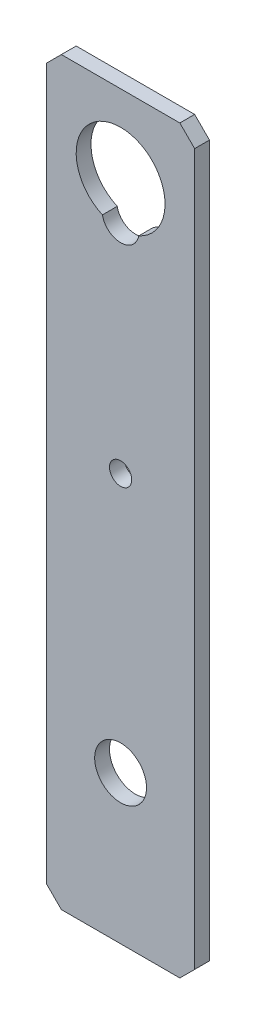
ISO-10303-21;
HEADER;
FILE_DESCRIPTION(('STEP AP214'),'2;1');
FILE_NAME('part.step','',(''),(''),'','','');
FILE_SCHEMA(('AUTOMOTIVE_DESIGN { 1 0 10303 214 1 1 1 1 }'));
ENDSEC;
DATA;
#1=APPLICATION_CONTEXT('core data for automotive mechanical design processes');
#2=APPLICATION_PROTOCOL_DEFINITION('international standard','automotive_design',2000,#1);
#3=PRODUCT_CONTEXT('',#1,'mechanical');
#4=PRODUCT('Part','Part','',(#3));
#5=PRODUCT_RELATED_PRODUCT_CATEGORY('part','',(#4));
#6=PRODUCT_DEFINITION_FORMATION('','',#4);
#7=PRODUCT_DEFINITION_CONTEXT('part definition',#1,'design');
#8=PRODUCT_DEFINITION('design','',#6,#7);
#9=PRODUCT_DEFINITION_SHAPE('','',#8);
#10=(LENGTH_UNIT() NAMED_UNIT(*) SI_UNIT(.MILLI.,.METRE.));
#11=(NAMED_UNIT(*) PLANE_ANGLE_UNIT() SI_UNIT($,.RADIAN.));
#12=(NAMED_UNIT(*) SI_UNIT($,.STERADIAN.) SOLID_ANGLE_UNIT());
#13=UNCERTAINTY_MEASURE_WITH_UNIT(LENGTH_MEASURE(1.E-05),#10,'distance_accuracy_value','');
#14=(GEOMETRIC_REPRESENTATION_CONTEXT(3) GLOBAL_UNCERTAINTY_ASSIGNED_CONTEXT((#13)) GLOBAL_UNIT_ASSIGNED_CONTEXT((#10,
#11,#12)) REPRESENTATION_CONTEXT('',''));
#15=CARTESIAN_POINT('',(0.,0.,0.));
#16=DIRECTION('',(0.,0.,1.));
#17=DIRECTION('',(1.,0.,0.));
#18=AXIS2_PLACEMENT_3D('',#15,#16,#17);
#19=CARTESIAN_POINT('',(9.99999999999999,50.,2.));
#20=DIRECTION('',(-1.,0.,0.));
#21=DIRECTION('',(0.,-1.,0.));
#22=AXIS2_PLACEMENT_3D('',#19,#20,#21);
#23=PLANE('',#22);
#24=DIRECTION('',(0.,1.,0.));
#25=VECTOR('',#24,1.);
#26=CARTESIAN_POINT('',(9.99999999999999,50.,0.));
#27=LINE('',#26,#25);
#28=CARTESIAN_POINT('',(10.,-48.,0.));
#29=VERTEX_POINT('',#28);
#30=CARTESIAN_POINT('',(9.99999999999999,48.,0.));
#31=VERTEX_POINT('',#30);
#32=EDGE_CURVE('E153',#29,#31,#27,.T.);
#33=ORIENTED_EDGE('',*,*,#32,.T.);
#34=DIRECTION('',(0.,0.,1.));
#35=VECTOR('',#34,1.);
#36=CARTESIAN_POINT('',(9.99999999999999,48.,2.));
#37=LINE('',#36,#35);
#38=CARTESIAN_POINT('',(9.99999999999999,48.,2.));
#39=VERTEX_POINT('',#38);
#40=EDGE_CURVE('E190',#31,#39,#37,.T.);
#41=ORIENTED_EDGE('',*,*,#40,.T.);
#42=DIRECTION('',(0.,1.,0.));
#43=VECTOR('',#42,1.);
#44=CARTESIAN_POINT('',(9.99999999999999,50.,2.));
#45=LINE('',#44,#43);
#46=CARTESIAN_POINT('',(10.,-48.,2.));
#47=VERTEX_POINT('',#46);
#48=EDGE_CURVE('E154',#47,#39,#45,.T.);
#49=ORIENTED_EDGE('',*,*,#48,.F.);
#50=DIRECTION('',(0.,0.,-1.));
#51=VECTOR('',#50,1.);
#52=CARTESIAN_POINT('',(10.,-48.,2.));
#53=LINE('',#52,#51);
#54=EDGE_CURVE('E187',#47,#29,#53,.T.);
#55=ORIENTED_EDGE('',*,*,#54,.T.);
#56=EDGE_LOOP('',(#33,#41,#49,#55));
#57=FACE_BOUND('',#56,.T.);
#58=ADVANCED_FACE('F43',(#57),#23,.F.);
#59=CARTESIAN_POINT('',(-10.,50.,2.));
#60=DIRECTION('',(0.,-1.,0.));
#61=DIRECTION('',(0.,0.,-1.));
#62=AXIS2_PLACEMENT_3D('',#59,#60,#61);
#63=PLANE('',#62);
#64=DIRECTION('',(-1.,0.,0.));
#65=VECTOR('',#64,1.);
#66=CARTESIAN_POINT('',(-10.,50.,2.));
#67=LINE('',#66,#65);
#68=CARTESIAN_POINT('',(7.99999999999999,50.,2.));
#69=VERTEX_POINT('',#68);
#70=CARTESIAN_POINT('',(-8.,50.,2.));
#71=VERTEX_POINT('',#70);
#72=EDGE_CURVE('E157',#69,#71,#67,.T.);
#73=ORIENTED_EDGE('',*,*,#72,.F.);
#74=DIRECTION('',(0.,0.,-1.));
#75=VECTOR('',#74,1.);
#76=CARTESIAN_POINT('',(7.99999999999999,50.,2.));
#77=LINE('',#76,#75);
#78=CARTESIAN_POINT('',(7.99999999999999,50.,0.));
#79=VERTEX_POINT('',#78);
#80=EDGE_CURVE('E176',#69,#79,#77,.T.);
#81=ORIENTED_EDGE('',*,*,#80,.T.);
#82=DIRECTION('',(-1.,0.,0.));
#83=VECTOR('',#82,1.);
#84=CARTESIAN_POINT('',(-10.,50.,0.));
#85=LINE('',#84,#83);
#86=CARTESIAN_POINT('',(-8.,50.,0.));
#87=VERTEX_POINT('',#86);
#88=EDGE_CURVE('E168',#79,#87,#85,.T.);
#89=ORIENTED_EDGE('',*,*,#88,.T.);
#90=DIRECTION('',(0.,0.,1.));
#91=VECTOR('',#90,1.);
#92=CARTESIAN_POINT('',(-8.,50.,2.));
#93=LINE('',#92,#91);
#94=EDGE_CURVE('E165',#87,#71,#93,.T.);
#95=ORIENTED_EDGE('',*,*,#94,.T.);
#96=EDGE_LOOP('',(#73,#81,#89,#95));
#97=FACE_BOUND('',#96,.T.);
#98=ADVANCED_FACE('F233',(#97),#63,.F.);
#99=CARTESIAN_POINT('',(-10.,50.,2.));
#100=DIRECTION('',(1.,0.,0.));
#101=DIRECTION('',(0.,1.,0.));
#102=AXIS2_PLACEMENT_3D('',#99,#100,#101);
#103=PLANE('',#102);
#104=DIRECTION('',(0.,-1.,0.));
#105=VECTOR('',#104,1.);
#106=CARTESIAN_POINT('',(-10.,50.,0.));
#107=LINE('',#106,#105);
#108=CARTESIAN_POINT('',(-10.,48.,0.));
#109=VERTEX_POINT('',#108);
#110=CARTESIAN_POINT('',(-9.99999999999999,-48.,0.));
#111=VERTEX_POINT('',#110);
#112=EDGE_CURVE('E171',#109,#111,#107,.T.);
#113=ORIENTED_EDGE('',*,*,#112,.T.);
#114=DIRECTION('',(0.,0.,1.));
#115=VECTOR('',#114,1.);
#116=CARTESIAN_POINT('',(-9.99999999999999,-48.,2.));
#117=LINE('',#116,#115);
#118=CARTESIAN_POINT('',(-9.99999999999999,-48.,2.));
#119=VERTEX_POINT('',#118);
#120=EDGE_CURVE('E11',#111,#119,#117,.T.);
#121=ORIENTED_EDGE('',*,*,#120,.T.);
#122=DIRECTION('',(0.,-1.,0.));
#123=VECTOR('',#122,1.);
#124=CARTESIAN_POINT('',(-10.,50.,2.));
#125=LINE('',#124,#123);
#126=CARTESIAN_POINT('',(-10.,48.,2.));
#127=VERTEX_POINT('',#126);
#128=EDGE_CURVE('E161',#127,#119,#125,.T.);
#129=ORIENTED_EDGE('',*,*,#128,.F.);
#130=DIRECTION('',(0.,0.,-1.));
#131=VECTOR('',#130,1.);
#132=CARTESIAN_POINT('',(-10.,48.,2.));
#133=LINE('',#132,#131);
#134=EDGE_CURVE('E52',#127,#109,#133,.T.);
#135=ORIENTED_EDGE('',*,*,#134,.T.);
#136=EDGE_LOOP('',(#113,#121,#129,#135));
#137=FACE_BOUND('',#136,.T.);
#138=ADVANCED_FACE('F207',(#137),#103,.F.);
#139=CARTESIAN_POINT('',(-9.99999999999999,-50.,2.));
#140=DIRECTION('',(0.,1.,0.));
#141=DIRECTION('',(0.,0.,1.));
#142=AXIS2_PLACEMENT_3D('',#139,#140,#141);
#143=PLANE('',#142);
#144=DIRECTION('',(1.,0.,0.));
#145=VECTOR('',#144,1.);
#146=CARTESIAN_POINT('',(-9.99999999999999,-50.,0.));
#147=LINE('',#146,#145);
#148=CARTESIAN_POINT('',(-7.99999999999998,-50.,0.));
#149=VERTEX_POINT('',#148);
#150=CARTESIAN_POINT('',(8.00000000000001,-50.,0.));
#151=VERTEX_POINT('',#150);
#152=EDGE_CURVE('E158',#149,#151,#147,.T.);
#153=ORIENTED_EDGE('',*,*,#152,.T.);
#154=DIRECTION('',(0.,0.,1.));
#155=VECTOR('',#154,1.);
#156=CARTESIAN_POINT('',(8.00000000000001,-50.,2.));
#157=LINE('',#156,#155);
#158=CARTESIAN_POINT('',(8.00000000000001,-50.,2.));
#159=VERTEX_POINT('',#158);
#160=EDGE_CURVE('E59',#151,#159,#157,.T.);
#161=ORIENTED_EDGE('',*,*,#160,.T.);
#162=DIRECTION('',(1.,0.,0.));
#163=VECTOR('',#162,1.);
#164=CARTESIAN_POINT('',(-9.99999999999999,-50.,2.));
#165=LINE('',#164,#163);
#166=CARTESIAN_POINT('',(-7.99999999999998,-50.,2.));
#167=VERTEX_POINT('',#166);
#168=EDGE_CURVE('E163',#167,#159,#165,.T.);
#169=ORIENTED_EDGE('',*,*,#168,.F.);
#170=DIRECTION('',(0.,0.,-1.));
#171=VECTOR('',#170,1.);
#172=CARTESIAN_POINT('',(-7.99999999999998,-50.,2.));
#173=LINE('',#172,#171);
#174=EDGE_CURVE('E199',#167,#149,#173,.T.);
#175=ORIENTED_EDGE('',*,*,#174,.T.);
#176=EDGE_LOOP('',(#153,#161,#169,#175));
#177=FACE_BOUND('',#176,.T.);
#178=ADVANCED_FACE('F218',(#177),#143,.F.);
#179=CARTESIAN_POINT('',(0.,0.,2.));
#180=DIRECTION('',(0.,0.,1.));
#181=DIRECTION('',(1.,0.,0.));
#182=AXIS2_PLACEMENT_3D('',#179,#180,#181);
#183=PLANE('',#182);
#184=CARTESIAN_POINT('',(0.,34.5,2.));
#185=DIRECTION('',(0.,0.,1.));
#186=DIRECTION('',(1.,0.,0.));
#187=AXIS2_PLACEMENT_3D('',#184,#185,#186);
#188=CIRCLE('',#187,2.5);
#189=CARTESIAN_POINT('',(-2.45446022579303,34.025,2.));
#190=VERTEX_POINT('',#189);
#191=CARTESIAN_POINT('',(2.45446022579304,34.025,2.));
#192=VERTEX_POINT('',#191);
#193=EDGE_CURVE('E125',#190,#192,#188,.T.);
#194=ORIENTED_EDGE('',*,*,#193,.F.);
#195=CARTESIAN_POINT('',(0.,39.5,2.));
#196=DIRECTION('',(0.,0.,1.));
#197=DIRECTION('',(1.,0.,0.));
#198=AXIS2_PLACEMENT_3D('',#195,#196,#197);
#199=CIRCLE('',#198,6.);
#200=EDGE_CURVE('E136',#192,#190,#199,.T.);
#201=ORIENTED_EDGE('',*,*,#200,.F.);
#202=EDGE_LOOP('',(#194,#201));
#203=FACE_BOUND('',#202,.T.);
#204=CARTESIAN_POINT('',(0.,-30.,2.));
#205=DIRECTION('',(0.,0.,1.));
#206=DIRECTION('',(1.,0.,0.));
#207=AXIS2_PLACEMENT_3D('',#204,#205,#206);
#208=CIRCLE('',#207,3.5);
#209=CARTESIAN_POINT('',(3.50000000000001,-30.,2.));
#210=VERTEX_POINT('',#209);
#211=EDGE_CURVE('E150',#210,#210,#208,.T.);
#212=ORIENTED_EDGE('',*,*,#211,.F.);
#213=EDGE_LOOP('',(#212));
#214=FACE_BOUND('',#213,.T.);
#215=CARTESIAN_POINT('',(0.,5.,2.));
#216=DIRECTION('',(0.,0.,1.));
#217=DIRECTION('',(1.,0.,0.));
#218=AXIS2_PLACEMENT_3D('',#215,#216,#217);
#219=CIRCLE('',#218,1.5);
#220=CARTESIAN_POINT('',(1.50000000000001,5.,2.));
#221=VERTEX_POINT('',#220);
#222=EDGE_CURVE('E146',#221,#221,#219,.T.);
#223=ORIENTED_EDGE('',*,*,#222,.F.);
#224=EDGE_LOOP('',(#223));
#225=FACE_BOUND('',#224,.T.);
#226=ORIENTED_EDGE('',*,*,#48,.T.);
#227=DIRECTION('',(0.707106781186548,-0.707106781186548,0.));
#228=VECTOR('',#227,1.);
#229=CARTESIAN_POINT('',(29.,29.,2.));
#230=LINE('',#229,#228);
#231=EDGE_CURVE('E197',#39,#69,#230,.F.);
#232=ORIENTED_EDGE('',*,*,#231,.T.);
#233=ORIENTED_EDGE('',*,*,#72,.T.);
#234=DIRECTION('',(0.707106781186548,0.707106781186548,0.));
#235=VECTOR('',#234,1.);
#236=CARTESIAN_POINT('',(-29.,29.,2.));
#237=LINE('',#236,#235);
#238=EDGE_CURVE('E192',#71,#127,#237,.F.);
#239=ORIENTED_EDGE('',*,*,#238,.T.);
#240=ORIENTED_EDGE('',*,*,#128,.T.);
#241=DIRECTION('',(-0.707106781186548,0.707106781186548,0.));
#242=VECTOR('',#241,1.);
#243=CARTESIAN_POINT('',(-29.,-29.,2.));
#244=LINE('',#243,#242);
#245=EDGE_CURVE('E66',#119,#167,#244,.F.);
#246=ORIENTED_EDGE('',*,*,#245,.T.);
#247=ORIENTED_EDGE('',*,*,#168,.T.);
#248=DIRECTION('',(-0.707106781186548,-0.707106781186548,0.));
#249=VECTOR('',#248,1.);
#250=CARTESIAN_POINT('',(29.,-29.,2.));
#251=LINE('',#250,#249);
#252=EDGE_CURVE('E195',#159,#47,#251,.F.);
#253=ORIENTED_EDGE('',*,*,#252,.T.);
#254=EDGE_LOOP('',(#226,#232,#233,#239,#240,#246,#247,#253));
#255=FACE_BOUND('',#254,.T.);
#256=ADVANCED_FACE('F140',(#203,#214,#225,#255),#183,.T.);
#257=CARTESIAN_POINT('',(0.,0.,0.));
#258=DIRECTION('',(0.,0.,1.));
#259=DIRECTION('',(1.,0.,0.));
#260=AXIS2_PLACEMENT_3D('',#257,#258,#259);
#261=PLANE('',#260);
#262=CARTESIAN_POINT('',(0.,39.5,0.));
#263=DIRECTION('',(0.,0.,1.));
#264=DIRECTION('',(1.,0.,0.));
#265=AXIS2_PLACEMENT_3D('',#262,#263,#264);
#266=CIRCLE('',#265,6.);
#267=CARTESIAN_POINT('',(-2.45446022579303,34.025,0.));
#268=VERTEX_POINT('',#267);
#269=CARTESIAN_POINT('',(2.45446022579304,34.025,0.));
#270=VERTEX_POINT('',#269);
#271=EDGE_CURVE('E133',#268,#270,#266,.F.);
#272=ORIENTED_EDGE('',*,*,#271,.F.);
#273=CARTESIAN_POINT('',(0.,34.5,0.));
#274=DIRECTION('',(0.,0.,1.));
#275=DIRECTION('',(1.,0.,0.));
#276=AXIS2_PLACEMENT_3D('',#273,#274,#275);
#277=CIRCLE('',#276,2.5);
#278=EDGE_CURVE('E128',#270,#268,#277,.F.);
#279=ORIENTED_EDGE('',*,*,#278,.F.);
#280=EDGE_LOOP('',(#272,#279));
#281=FACE_BOUND('',#280,.T.);
#282=CARTESIAN_POINT('',(0.,-30.,0.));
#283=DIRECTION('',(0.,0.,1.));
#284=DIRECTION('',(1.,0.,0.));
#285=AXIS2_PLACEMENT_3D('',#282,#283,#284);
#286=CIRCLE('',#285,3.5);
#287=CARTESIAN_POINT('',(3.50000000000001,-30.,0.));
#288=VERTEX_POINT('',#287);
#289=EDGE_CURVE('E143',#288,#288,#286,.F.);
#290=ORIENTED_EDGE('',*,*,#289,.F.);
#291=EDGE_LOOP('',(#290));
#292=FACE_BOUND('',#291,.T.);
#293=CARTESIAN_POINT('',(0.,5.,0.));
#294=DIRECTION('',(0.,0.,1.));
#295=DIRECTION('',(1.,0.,0.));
#296=AXIS2_PLACEMENT_3D('',#293,#294,#295);
#297=CIRCLE('',#296,1.5);
#298=CARTESIAN_POINT('',(1.50000000000001,5.,0.));
#299=VERTEX_POINT('',#298);
#300=EDGE_CURVE('E149',#299,#299,#297,.F.);
#301=ORIENTED_EDGE('',*,*,#300,.F.);
#302=EDGE_LOOP('',(#301));
#303=FACE_BOUND('',#302,.T.);
#304=ORIENTED_EDGE('',*,*,#88,.F.);
#305=DIRECTION('',(-0.707106781186548,0.707106781186548,0.));
#306=VECTOR('',#305,1.);
#307=CARTESIAN_POINT('',(7.99999999999999,50.,0.));
#308=LINE('',#307,#306);
#309=EDGE_CURVE('E185',#79,#31,#308,.F.);
#310=ORIENTED_EDGE('',*,*,#309,.T.);
#311=ORIENTED_EDGE('',*,*,#32,.F.);
#312=DIRECTION('',(0.707106781186548,0.707106781186548,0.));
#313=VECTOR('',#312,1.);
#314=CARTESIAN_POINT('',(10.,-48.,0.));
#315=LINE('',#314,#313);
#316=EDGE_CURVE('E183',#29,#151,#315,.F.);
#317=ORIENTED_EDGE('',*,*,#316,.T.);
#318=ORIENTED_EDGE('',*,*,#152,.F.);
#319=DIRECTION('',(0.707106781186548,-0.707106781186548,0.));
#320=VECTOR('',#319,1.);
#321=CARTESIAN_POINT('',(-7.99999999999998,-50.,0.));
#322=LINE('',#321,#320);
#323=EDGE_CURVE('E181',#149,#111,#322,.F.);
#324=ORIENTED_EDGE('',*,*,#323,.T.);
#325=ORIENTED_EDGE('',*,*,#112,.F.);
#326=DIRECTION('',(-0.707106781186548,-0.707106781186548,0.));
#327=VECTOR('',#326,1.);
#328=CARTESIAN_POINT('',(-10.,48.,0.));
#329=LINE('',#328,#327);
#330=EDGE_CURVE('E179',#109,#87,#329,.F.);
#331=ORIENTED_EDGE('',*,*,#330,.T.);
#332=EDGE_LOOP('',(#304,#310,#311,#317,#318,#324,#325,#331));
#333=FACE_BOUND('',#332,.T.);
#334=ADVANCED_FACE('F213',(#281,#292,#303,#333),#261,.F.);
#335=CARTESIAN_POINT('',(0.,5.,-0.00100000000000013));
#336=DIRECTION('',(0.,0.,1.));
#337=DIRECTION('',(1.,0.,0.));
#338=AXIS2_PLACEMENT_3D('',#335,#336,#337);
#339=CYLINDRICAL_SURFACE('',#338,1.5);
#340=ORIENTED_EDGE('',*,*,#222,.T.);
#341=EDGE_LOOP('',(#340));
#342=FACE_BOUND('',#341,.T.);
#343=ORIENTED_EDGE('',*,*,#300,.T.);
#344=EDGE_LOOP('',(#343));
#345=FACE_BOUND('',#344,.T.);
#346=ADVANCED_FACE('F304',(#342,#345),#339,.F.);
#347=CARTESIAN_POINT('',(0.,-30.,-0.00100000000000013));
#348=DIRECTION('',(0.,0.,1.));
#349=DIRECTION('',(1.,0.,0.));
#350=AXIS2_PLACEMENT_3D('',#347,#348,#349);
#351=CYLINDRICAL_SURFACE('',#350,3.5);
#352=ORIENTED_EDGE('',*,*,#211,.T.);
#353=EDGE_LOOP('',(#352));
#354=FACE_BOUND('',#353,.T.);
#355=ORIENTED_EDGE('',*,*,#289,.T.);
#356=EDGE_LOOP('',(#355));
#357=FACE_BOUND('',#356,.T.);
#358=ADVANCED_FACE('F296',(#354,#357),#351,.F.);
#359=CARTESIAN_POINT('',(0.,34.5,-0.00100000000000013));
#360=DIRECTION('',(0.,0.,1.));
#361=DIRECTION('',(1.,0.,0.));
#362=AXIS2_PLACEMENT_3D('',#359,#360,#361);
#363=CYLINDRICAL_SURFACE('',#362,2.5);
#364=ORIENTED_EDGE('',*,*,#278,.T.);
#365=DIRECTION('',(0.,0.,1.));
#366=VECTOR('',#365,1.);
#367=CARTESIAN_POINT('',(-2.45446022579303,34.025,-0.00100000000000013));
#368=LINE('',#367,#366);
#369=EDGE_CURVE('E121',#268,#190,#368,.T.);
#370=ORIENTED_EDGE('',*,*,#369,.T.);
#371=ORIENTED_EDGE('',*,*,#193,.T.);
#372=DIRECTION('',(0.,0.,1.));
#373=VECTOR('',#372,1.);
#374=CARTESIAN_POINT('',(2.45446022579304,34.025,-0.00100000000000013));
#375=LINE('',#374,#373);
#376=EDGE_CURVE('E132',#270,#192,#375,.T.);
#377=ORIENTED_EDGE('',*,*,#376,.F.);
#378=EDGE_LOOP('',(#364,#370,#371,#377));
#379=FACE_BOUND('',#378,.T.);
#380=ADVANCED_FACE('F123',(#379),#363,.F.);
#381=CARTESIAN_POINT('',(0.,39.5,-0.00100000000000013));
#382=DIRECTION('',(0.,0.,1.));
#383=DIRECTION('',(1.,0.,0.));
#384=AXIS2_PLACEMENT_3D('',#381,#382,#383);
#385=CYLINDRICAL_SURFACE('',#384,6.);
#386=ORIENTED_EDGE('',*,*,#271,.T.);
#387=ORIENTED_EDGE('',*,*,#376,.T.);
#388=ORIENTED_EDGE('',*,*,#200,.T.);
#389=ORIENTED_EDGE('',*,*,#369,.F.);
#390=EDGE_LOOP('',(#386,#387,#388,#389));
#391=FACE_BOUND('',#390,.T.);
#392=ADVANCED_FACE('F137',(#391),#385,.F.);
#393=CARTESIAN_POINT('',(7.99999999999999,50.,2.));
#394=DIRECTION('',(-0.707106781186547,-0.707106781186547,0.));
#395=DIRECTION('',(0.,0.,-1.));
#396=AXIS2_PLACEMENT_3D('',#393,#394,#395);
#397=PLANE('',#396);
#398=ORIENTED_EDGE('',*,*,#231,.F.);
#399=ORIENTED_EDGE('',*,*,#40,.F.);
#400=ORIENTED_EDGE('',*,*,#309,.F.);
#401=ORIENTED_EDGE('',*,*,#80,.F.);
#402=EDGE_LOOP('',(#398,#399,#400,#401));
#403=FACE_BOUND('',#402,.T.);
#404=ADVANCED_FACE('F230',(#403),#397,.F.);
#405=CARTESIAN_POINT('',(10.,-48.,2.));
#406=DIRECTION('',(-0.707106781186547,0.707106781186547,0.));
#407=DIRECTION('',(0.,0.,-1.));
#408=AXIS2_PLACEMENT_3D('',#405,#406,#407);
#409=PLANE('',#408);
#410=ORIENTED_EDGE('',*,*,#252,.F.);
#411=ORIENTED_EDGE('',*,*,#160,.F.);
#412=ORIENTED_EDGE('',*,*,#316,.F.);
#413=ORIENTED_EDGE('',*,*,#54,.F.);
#414=EDGE_LOOP('',(#410,#411,#412,#413));
#415=FACE_BOUND('',#414,.T.);
#416=ADVANCED_FACE('F223',(#415),#409,.F.);
#417=CARTESIAN_POINT('',(-7.99999999999998,-50.,2.));
#418=DIRECTION('',(0.707106781186547,0.707106781186547,0.));
#419=DIRECTION('',(0.,0.,-1.));
#420=AXIS2_PLACEMENT_3D('',#417,#418,#419);
#421=PLANE('',#420);
#422=ORIENTED_EDGE('',*,*,#245,.F.);
#423=ORIENTED_EDGE('',*,*,#120,.F.);
#424=ORIENTED_EDGE('',*,*,#323,.F.);
#425=ORIENTED_EDGE('',*,*,#174,.F.);
#426=EDGE_LOOP('',(#422,#423,#424,#425));
#427=FACE_BOUND('',#426,.T.);
#428=ADVANCED_FACE('F217',(#427),#421,.F.);
#429=CARTESIAN_POINT('',(-10.,48.,2.));
#430=DIRECTION('',(0.707106781186547,-0.707106781186547,0.));
#431=DIRECTION('',(0.,0.,-1.));
#432=AXIS2_PLACEMENT_3D('',#429,#430,#431);
#433=PLANE('',#432);
#434=ORIENTED_EDGE('',*,*,#238,.F.);
#435=ORIENTED_EDGE('',*,*,#94,.F.);
#436=ORIENTED_EDGE('',*,*,#330,.F.);
#437=ORIENTED_EDGE('',*,*,#134,.F.);
#438=EDGE_LOOP('',(#434,#435,#436,#437));
#439=FACE_BOUND('',#438,.T.);
#440=ADVANCED_FACE('F46',(#439),#433,.F.);
#441=CLOSED_SHELL('',(#58,#98,#138,#178,#256,#334,#346,#358,#380,#392,#404,#416,#428,#440));
#442=MANIFOLD_SOLID_BREP('B2',#441);
#443=ADVANCED_BREP_SHAPE_REPRESENTATION('',(#18,#442),#14);
#444=SHAPE_DEFINITION_REPRESENTATION(#9,#443);
ENDSEC;
END-ISO-10303-21;
